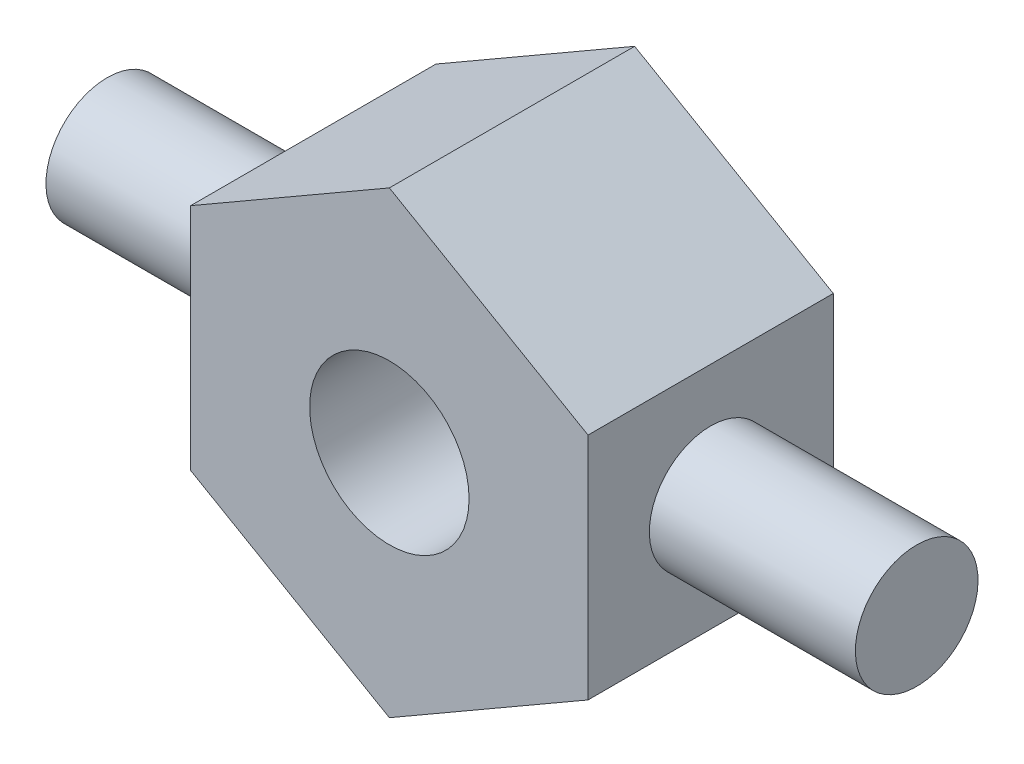
ISO-10303-21;
HEADER;
FILE_DESCRIPTION(('STEP AP214'),'2;1');
FILE_NAME('part.step','',(''),(''),'','','');
FILE_SCHEMA(('AUTOMOTIVE_DESIGN { 1 0 10303 214 1 1 1 1 }'));
ENDSEC;
DATA;
#1=APPLICATION_CONTEXT('core data for automotive mechanical design processes');
#2=APPLICATION_PROTOCOL_DEFINITION('international standard','automotive_design',2000,#1);
#3=PRODUCT_CONTEXT('',#1,'mechanical');
#4=PRODUCT('Part','Part','',(#3));
#5=PRODUCT_RELATED_PRODUCT_CATEGORY('part','',(#4));
#6=PRODUCT_DEFINITION_FORMATION('','',#4);
#7=PRODUCT_DEFINITION_CONTEXT('part definition',#1,'design');
#8=PRODUCT_DEFINITION('design','',#6,#7);
#9=PRODUCT_DEFINITION_SHAPE('','',#8);
#10=(LENGTH_UNIT() NAMED_UNIT(*) SI_UNIT(.MILLI.,.METRE.));
#11=(NAMED_UNIT(*) PLANE_ANGLE_UNIT() SI_UNIT($,.RADIAN.));
#12=(NAMED_UNIT(*) SI_UNIT($,.STERADIAN.) SOLID_ANGLE_UNIT());
#13=UNCERTAINTY_MEASURE_WITH_UNIT(LENGTH_MEASURE(1.E-05),#10,'distance_accuracy_value','');
#14=(GEOMETRIC_REPRESENTATION_CONTEXT(3) GLOBAL_UNCERTAINTY_ASSIGNED_CONTEXT((#13)) GLOBAL_UNIT_ASSIGNED_CONTEXT((#10,
#11,#12)) REPRESENTATION_CONTEXT('',''));
#15=CARTESIAN_POINT('',(0.,0.,0.));
#16=DIRECTION('',(0.,0.,1.));
#17=DIRECTION('',(1.,0.,0.));
#18=AXIS2_PLACEMENT_3D('',#15,#16,#17);
#19=CARTESIAN_POINT('',(-80.9999999999995,-46.7653718043607,-50.));
#20=DIRECTION('',(-0.499999999999995,-0.866025403784442,0.));
#21=DIRECTION('',(0.866025403784442,-0.499999999999995,0.));
#22=AXIS2_PLACEMENT_3D('',#19,#20,#21);
#23=PLANE('',#22);
#24=DIRECTION('',(0.,0.,1.));
#25=VECTOR('',#24,1.);
#26=CARTESIAN_POINT('',(0.,-93.5307436087194,-50.));
#27=LINE('',#26,#25);
#28=CARTESIAN_POINT('',(0.,-93.5307436087194,-50.));
#29=VERTEX_POINT('',#28);
#30=CARTESIAN_POINT('',(0.,-93.5307436087194,50.));
#31=VERTEX_POINT('',#30);
#32=EDGE_CURVE('E89',#29,#31,#27,.T.);
#33=ORIENTED_EDGE('',*,*,#32,.T.);
#34=DIRECTION('',(0.866025403784441,-0.499999999999995,0.));
#35=VECTOR('',#34,1.);
#36=CARTESIAN_POINT('',(-80.9999999999995,-46.7653718043607,50.));
#37=LINE('',#36,#35);
#38=CARTESIAN_POINT('',(-80.9999999999995,-46.7653718043607,50.));
#39=VERTEX_POINT('',#38);
#40=EDGE_CURVE('E92',#39,#31,#37,.T.);
#41=ORIENTED_EDGE('',*,*,#40,.F.);
#42=DIRECTION('',(0.,0.,1.));
#43=VECTOR('',#42,1.);
#44=CARTESIAN_POINT('',(-80.9999999999995,-46.7653718043607,-50.));
#45=LINE('',#44,#43);
#46=CARTESIAN_POINT('',(-80.9999999999995,-46.7653718043607,-50.));
#47=VERTEX_POINT('',#46);
#48=EDGE_CURVE('E52',#47,#39,#45,.T.);
#49=ORIENTED_EDGE('',*,*,#48,.F.);
#50=DIRECTION('',(0.866025403784441,-0.499999999999995,0.));
#51=VECTOR('',#50,1.);
#52=CARTESIAN_POINT('',(-80.9999999999995,-46.7653718043607,-50.));
#53=LINE('',#52,#51);
#54=EDGE_CURVE('E93',#47,#29,#53,.T.);
#55=ORIENTED_EDGE('',*,*,#54,.T.);
#56=EDGE_LOOP('',(#33,#41,#49,#55));
#57=FACE_BOUND('',#56,.T.);
#58=ADVANCED_FACE('F37',(#57),#23,.T.);
#59=CARTESIAN_POINT('',(-81.0000000000005,46.765371804359,-50.));
#60=DIRECTION('',(-1.,0.,0.));
#61=DIRECTION('',(0.,-1.,0.));
#62=AXIS2_PLACEMENT_3D('',#59,#60,#61);
#63=PLANE('',#62);
#64=CARTESIAN_POINT('',(-81.,0.,0.));
#65=DIRECTION('',(-1.,0.,0.));
#66=DIRECTION('',(0.,-1.,0.));
#67=AXIS2_PLACEMENT_3D('',#64,#65,#66);
#68=CIRCLE('',#67,25.);
#69=CARTESIAN_POINT('',(-80.9999999999998,-25.,0.));
#70=VERTEX_POINT('',#69);
#71=EDGE_CURVE('E11',#70,#70,#68,.T.);
#72=ORIENTED_EDGE('',*,*,#71,.F.);
#73=EDGE_LOOP('',(#72));
#74=FACE_BOUND('',#73,.T.);
#75=ORIENTED_EDGE('',*,*,#48,.T.);
#76=DIRECTION('',(0.,-1.,0.));
#77=VECTOR('',#76,1.);
#78=CARTESIAN_POINT('',(-81.0000000000005,46.765371804359,50.));
#79=LINE('',#78,#77);
#80=CARTESIAN_POINT('',(-81.0000000000005,46.765371804359,50.));
#81=VERTEX_POINT('',#80);
#82=EDGE_CURVE('E110',#81,#39,#79,.T.);
#83=ORIENTED_EDGE('',*,*,#82,.F.);
#84=DIRECTION('',(0.,0.,1.));
#85=VECTOR('',#84,1.);
#86=CARTESIAN_POINT('',(-81.0000000000005,46.765371804359,-50.));
#87=LINE('',#86,#85);
#88=CARTESIAN_POINT('',(-81.0000000000005,46.765371804359,-50.));
#89=VERTEX_POINT('',#88);
#90=EDGE_CURVE('E60',#89,#81,#87,.T.);
#91=ORIENTED_EDGE('',*,*,#90,.F.);
#92=DIRECTION('',(0.,-1.,0.));
#93=VECTOR('',#92,1.);
#94=CARTESIAN_POINT('',(-81.0000000000005,46.765371804359,-50.));
#95=LINE('',#94,#93);
#96=EDGE_CURVE('E98',#89,#47,#95,.T.);
#97=ORIENTED_EDGE('',*,*,#96,.T.);
#98=EDGE_LOOP('',(#75,#83,#91,#97));
#99=FACE_BOUND('',#98,.T.);
#100=ADVANCED_FACE('F156',(#74,#99),#63,.T.);
#101=CARTESIAN_POINT('',(-6.53121691835931E-13,93.5307436087194,-50.));
#102=DIRECTION('',(-0.500000000000007,0.866025403784435,0.));
#103=DIRECTION('',(-0.866025403784435,-0.500000000000007,0.));
#104=AXIS2_PLACEMENT_3D('',#101,#102,#103);
#105=PLANE('',#104);
#106=ORIENTED_EDGE('',*,*,#90,.T.);
#107=DIRECTION('',(-0.866025403784435,-0.500000000000007,0.));
#108=VECTOR('',#107,1.);
#109=CARTESIAN_POINT('',(-6.53121691835931E-13,93.5307436087194,50.));
#110=LINE('',#109,#108);
#111=CARTESIAN_POINT('',(-6.53121691835931E-13,93.5307436087194,50.));
#112=VERTEX_POINT('',#111);
#113=EDGE_CURVE('E121',#112,#81,#110,.T.);
#114=ORIENTED_EDGE('',*,*,#113,.F.);
#115=DIRECTION('',(0.,0.,1.));
#116=VECTOR('',#115,1.);
#117=CARTESIAN_POINT('',(-6.53121691835931E-13,93.5307436087194,-50.));
#118=LINE('',#117,#116);
#119=CARTESIAN_POINT('',(-6.53121691835931E-13,93.5307436087194,-50.));
#120=VERTEX_POINT('',#119);
#121=EDGE_CURVE('E138',#120,#112,#118,.T.);
#122=ORIENTED_EDGE('',*,*,#121,.F.);
#123=DIRECTION('',(-0.866025403784435,-0.500000000000007,0.));
#124=VECTOR('',#123,1.);
#125=CARTESIAN_POINT('',(-6.53121691835931E-13,93.5307436087194,-50.));
#126=LINE('',#125,#124);
#127=EDGE_CURVE('E133',#120,#89,#126,.T.);
#128=ORIENTED_EDGE('',*,*,#127,.T.);
#129=EDGE_LOOP('',(#106,#114,#122,#128));
#130=FACE_BOUND('',#129,.T.);
#131=ADVANCED_FACE('F152',(#130),#105,.T.);
#132=CARTESIAN_POINT('',(80.9999999999998,46.7653718043601,-50.));
#133=DIRECTION('',(0.499999999999995,0.866025403784442,0.));
#134=DIRECTION('',(-0.866025403784442,0.499999999999995,0.));
#135=AXIS2_PLACEMENT_3D('',#132,#133,#134);
#136=PLANE('',#135);
#137=ORIENTED_EDGE('',*,*,#121,.T.);
#138=DIRECTION('',(-0.866025403784442,0.499999999999995,0.));
#139=VECTOR('',#138,1.);
#140=CARTESIAN_POINT('',(80.9999999999998,46.7653718043601,50.));
#141=LINE('',#140,#139);
#142=CARTESIAN_POINT('',(80.9999999999998,46.7653718043601,50.));
#143=VERTEX_POINT('',#142);
#144=EDGE_CURVE('E118',#143,#112,#141,.T.);
#145=ORIENTED_EDGE('',*,*,#144,.F.);
#146=DIRECTION('',(0.,0.,1.));
#147=VECTOR('',#146,1.);
#148=CARTESIAN_POINT('',(80.9999999999998,46.7653718043601,-50.));
#149=LINE('',#148,#147);
#150=CARTESIAN_POINT('',(80.9999999999998,46.7653718043601,-50.));
#151=VERTEX_POINT('',#150);
#152=EDGE_CURVE('E140',#151,#143,#149,.T.);
#153=ORIENTED_EDGE('',*,*,#152,.F.);
#154=DIRECTION('',(-0.866025403784442,0.499999999999995,0.));
#155=VECTOR('',#154,1.);
#156=CARTESIAN_POINT('',(80.9999999999998,46.7653718043601,-50.));
#157=LINE('',#156,#155);
#158=EDGE_CURVE('E130',#151,#120,#157,.T.);
#159=ORIENTED_EDGE('',*,*,#158,.T.);
#160=EDGE_LOOP('',(#137,#145,#153,#159));
#161=FACE_BOUND('',#160,.T.);
#162=ADVANCED_FACE('F149',(#161),#136,.T.);
#163=CARTESIAN_POINT('',(81.0000000000002,-46.7653718043595,-50.));
#164=DIRECTION('',(1.,0.,0.));
#165=DIRECTION('',(0.,1.,0.));
#166=AXIS2_PLACEMENT_3D('',#163,#164,#165);
#167=PLANE('',#166);
#168=CARTESIAN_POINT('',(81.,0.,0.));
#169=DIRECTION('',(1.,0.,0.));
#170=DIRECTION('',(0.,1.,0.));
#171=AXIS2_PLACEMENT_3D('',#168,#169,#170);
#172=CIRCLE('',#171,25.);
#173=CARTESIAN_POINT('',(80.9999999999999,25.,0.));
#174=VERTEX_POINT('',#173);
#175=EDGE_CURVE('E40',#174,#174,#172,.T.);
#176=ORIENTED_EDGE('',*,*,#175,.F.);
#177=EDGE_LOOP('',(#176));
#178=FACE_BOUND('',#177,.T.);
#179=ORIENTED_EDGE('',*,*,#152,.T.);
#180=DIRECTION('',(0.,1.,0.));
#181=VECTOR('',#180,1.);
#182=CARTESIAN_POINT('',(81.0000000000002,-46.7653718043595,50.));
#183=LINE('',#182,#181);
#184=CARTESIAN_POINT('',(81.0000000000002,-46.7653718043595,50.));
#185=VERTEX_POINT('',#184);
#186=EDGE_CURVE('E105',#185,#143,#183,.T.);
#187=ORIENTED_EDGE('',*,*,#186,.F.);
#188=DIRECTION('',(0.,0.,1.));
#189=VECTOR('',#188,1.);
#190=CARTESIAN_POINT('',(81.0000000000002,-46.7653718043595,-50.));
#191=LINE('',#190,#189);
#192=CARTESIAN_POINT('',(81.0000000000002,-46.7653718043595,-50.));
#193=VERTEX_POINT('',#192);
#194=EDGE_CURVE('E97',#193,#185,#191,.T.);
#195=ORIENTED_EDGE('',*,*,#194,.F.);
#196=DIRECTION('',(0.,1.,0.));
#197=VECTOR('',#196,1.);
#198=CARTESIAN_POINT('',(81.0000000000002,-46.7653718043595,-50.));
#199=LINE('',#198,#197);
#200=EDGE_CURVE('E127',#193,#151,#199,.T.);
#201=ORIENTED_EDGE('',*,*,#200,.T.);
#202=EDGE_LOOP('',(#179,#187,#195,#201));
#203=FACE_BOUND('',#202,.T.);
#204=ADVANCED_FACE('F143',(#178,#203),#167,.T.);
#205=CARTESIAN_POINT('',(0.,-93.5307436087194,-50.));
#206=DIRECTION('',(0.500000000000001,-0.866025403784438,0.));
#207=DIRECTION('',(0.866025403784438,0.500000000000001,0.));
#208=AXIS2_PLACEMENT_3D('',#205,#206,#207);
#209=PLANE('',#208);
#210=ORIENTED_EDGE('',*,*,#194,.T.);
#211=DIRECTION('',(0.866025403784438,0.500000000000001,0.));
#212=VECTOR('',#211,1.);
#213=CARTESIAN_POINT('',(0.,-93.5307436087194,50.));
#214=LINE('',#213,#212);
#215=EDGE_CURVE('E100',#31,#185,#214,.T.);
#216=ORIENTED_EDGE('',*,*,#215,.F.);
#217=ORIENTED_EDGE('',*,*,#32,.F.);
#218=DIRECTION('',(0.866025403784438,0.500000000000001,0.));
#219=VECTOR('',#218,1.);
#220=CARTESIAN_POINT('',(0.,-93.5307436087194,-50.));
#221=LINE('',#220,#219);
#222=EDGE_CURVE('E125',#29,#193,#221,.T.);
#223=ORIENTED_EDGE('',*,*,#222,.T.);
#224=EDGE_LOOP('',(#210,#216,#217,#223));
#225=FACE_BOUND('',#224,.T.);
#226=ADVANCED_FACE('F101',(#225),#209,.T.);
#227=CARTESIAN_POINT('',(0.,0.,-50.));
#228=DIRECTION('',(0.,0.,1.));
#229=DIRECTION('',(1.,0.,0.));
#230=AXIS2_PLACEMENT_3D('',#227,#228,#229);
#231=PLANE('',#230);
#232=CARTESIAN_POINT('',(0.,0.,-50.));
#233=DIRECTION('',(0.,0.,1.));
#234=DIRECTION('',(1.,0.,0.));
#235=AXIS2_PLACEMENT_3D('',#232,#233,#234);
#236=CIRCLE('',#235,32.5);
#237=CARTESIAN_POINT('',(32.5,0.,-50.));
#238=VERTEX_POINT('',#237);
#239=EDGE_CURVE('E185',#238,#238,#236,.T.);
#240=ORIENTED_EDGE('',*,*,#239,.T.);
#241=EDGE_LOOP('',(#240));
#242=FACE_BOUND('',#241,.T.);
#243=ORIENTED_EDGE('',*,*,#54,.F.);
#244=ORIENTED_EDGE('',*,*,#96,.F.);
#245=ORIENTED_EDGE('',*,*,#127,.F.);
#246=ORIENTED_EDGE('',*,*,#158,.F.);
#247=ORIENTED_EDGE('',*,*,#200,.F.);
#248=ORIENTED_EDGE('',*,*,#222,.F.);
#249=EDGE_LOOP('',(#243,#244,#245,#246,#247,#248));
#250=FACE_BOUND('',#249,.T.);
#251=ADVANCED_FACE('F155',(#242,#250),#231,.F.);
#252=CARTESIAN_POINT('',(0.,0.,50.));
#253=DIRECTION('',(0.,0.,1.));
#254=DIRECTION('',(1.,0.,0.));
#255=AXIS2_PLACEMENT_3D('',#252,#253,#254);
#256=PLANE('',#255);
#257=CARTESIAN_POINT('',(0.,0.,50.));
#258=DIRECTION('',(0.,0.,1.));
#259=DIRECTION('',(1.,0.,0.));
#260=AXIS2_PLACEMENT_3D('',#257,#258,#259);
#261=CIRCLE('',#260,32.5);
#262=CARTESIAN_POINT('',(32.5,0.,50.));
#263=VERTEX_POINT('',#262);
#264=EDGE_CURVE('E187',#263,#263,#261,.T.);
#265=ORIENTED_EDGE('',*,*,#264,.F.);
#266=EDGE_LOOP('',(#265));
#267=FACE_BOUND('',#266,.T.);
#268=ORIENTED_EDGE('',*,*,#40,.T.);
#269=ORIENTED_EDGE('',*,*,#215,.T.);
#270=ORIENTED_EDGE('',*,*,#186,.T.);
#271=ORIENTED_EDGE('',*,*,#144,.T.);
#272=ORIENTED_EDGE('',*,*,#113,.T.);
#273=ORIENTED_EDGE('',*,*,#82,.T.);
#274=EDGE_LOOP('',(#268,#269,#270,#271,#272,#273));
#275=FACE_BOUND('',#274,.T.);
#276=ADVANCED_FACE('F108',(#267,#275),#256,.T.);
#277=CARTESIAN_POINT('',(165.,25.,0.));
#278=DIRECTION('',(1.,0.,0.));
#279=DIRECTION('',(0.,1.,0.));
#280=AXIS2_PLACEMENT_3D('',#277,#278,#279);
#281=PLANE('',#280);
#282=CARTESIAN_POINT('',(165.,0.,0.));
#283=DIRECTION('',(1.,0.,0.));
#284=DIRECTION('',(0.,1.,0.));
#285=AXIS2_PLACEMENT_3D('',#282,#283,#284);
#286=CIRCLE('',#285,25.);
#287=CARTESIAN_POINT('',(165.,25.,0.));
#288=VERTEX_POINT('',#287);
#289=EDGE_CURVE('E114',#288,#288,#286,.T.);
#290=ORIENTED_EDGE('',*,*,#289,.T.);
#291=EDGE_LOOP('',(#290));
#292=FACE_BOUND('',#291,.T.);
#293=ADVANCED_FACE('F181',(#292),#281,.T.);
#294=CARTESIAN_POINT('',(165.,0.,0.));
#295=DIRECTION('',(1.,0.,0.));
#296=DIRECTION('',(0.,1.,0.));
#297=AXIS2_PLACEMENT_3D('',#294,#295,#296);
#298=CYLINDRICAL_SURFACE('',#297,25.);
#299=ORIENTED_EDGE('',*,*,#175,.T.);
#300=EDGE_LOOP('',(#299));
#301=FACE_BOUND('',#300,.T.);
#302=ORIENTED_EDGE('',*,*,#289,.F.);
#303=EDGE_LOOP('',(#302));
#304=FACE_BOUND('',#303,.T.);
#305=ADVANCED_FACE('F208',(#301,#304),#298,.T.);
#306=ORIENTED_EDGE('',*,*,#71,.T.);
#307=EDGE_LOOP('',(#306));
#308=FACE_BOUND('',#307,.T.);
#309=CARTESIAN_POINT('',(-165.,0.,0.));
#310=DIRECTION('',(1.,0.,0.));
#311=DIRECTION('',(0.,1.,0.));
#312=AXIS2_PLACEMENT_3D('',#309,#310,#311);
#313=CIRCLE('',#312,25.);
#314=CARTESIAN_POINT('',(-165.,25.,0.));
#315=VERTEX_POINT('',#314);
#316=EDGE_CURVE('E111',#315,#315,#313,.T.);
#317=ORIENTED_EDGE('',*,*,#316,.T.);
#318=EDGE_LOOP('',(#317));
#319=FACE_BOUND('',#318,.T.);
#320=ADVANCED_FACE('F202',(#308,#319),#298,.T.);
#321=CARTESIAN_POINT('',(-165.,0.,0.));
#322=DIRECTION('',(-1.,0.,0.));
#323=DIRECTION('',(0.,-1.,0.));
#324=AXIS2_PLACEMENT_3D('',#321,#322,#323);
#325=PLANE('',#324);
#326=ORIENTED_EDGE('',*,*,#316,.F.);
#327=EDGE_LOOP('',(#326));
#328=FACE_BOUND('',#327,.T.);
#329=ADVANCED_FACE('F197',(#328),#325,.T.);
#330=CARTESIAN_POINT('',(0.,0.,-50.));
#331=DIRECTION('',(0.,0.,1.));
#332=DIRECTION('',(1.,0.,0.));
#333=AXIS2_PLACEMENT_3D('',#330,#331,#332);
#334=CYLINDRICAL_SURFACE('',#333,32.5);
#335=ORIENTED_EDGE('',*,*,#239,.F.);
#336=EDGE_LOOP('',(#335));
#337=FACE_BOUND('',#336,.T.);
#338=ORIENTED_EDGE('',*,*,#264,.T.);
#339=EDGE_LOOP('',(#338));
#340=FACE_BOUND('',#339,.T.);
#341=ADVANCED_FACE('F195',(#337,#340),#334,.F.);
#342=CLOSED_SHELL('',(#58,#100,#131,#162,#204,#226,#251,#276,#293,#305,#320,#329,#341));
#343=MANIFOLD_SOLID_BREP('B2',#342);
#344=ADVANCED_BREP_SHAPE_REPRESENTATION('',(#18,#343),#14);
#345=SHAPE_DEFINITION_REPRESENTATION(#9,#344);
ENDSEC;
END-ISO-10303-21;
